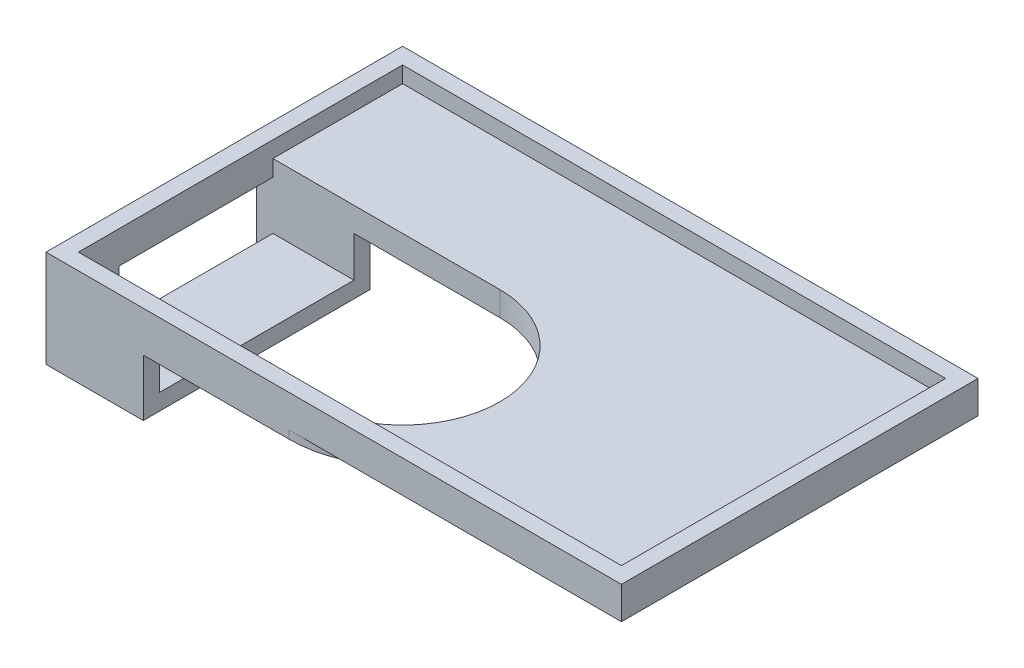
ISO-10303-21;
HEADER;
FILE_DESCRIPTION(('STEP AP214'),'2;1');
FILE_NAME('part.step','',(''),(''),'','','');
FILE_SCHEMA(('AUTOMOTIVE_DESIGN { 1 0 10303 214 1 1 1 1 }'));
ENDSEC;
DATA;
#1=APPLICATION_CONTEXT('core data for automotive mechanical design processes');
#2=APPLICATION_PROTOCOL_DEFINITION('international standard','automotive_design',2000,#1);
#3=PRODUCT_CONTEXT('',#1,'mechanical');
#4=PRODUCT('Part','Part','',(#3));
#5=PRODUCT_RELATED_PRODUCT_CATEGORY('part','',(#4));
#6=PRODUCT_DEFINITION_FORMATION('','',#4);
#7=PRODUCT_DEFINITION_CONTEXT('part definition',#1,'design');
#8=PRODUCT_DEFINITION('design','',#6,#7);
#9=PRODUCT_DEFINITION_SHAPE('','',#8);
#10=(LENGTH_UNIT() NAMED_UNIT(*) SI_UNIT(.MILLI.,.METRE.));
#11=(NAMED_UNIT(*) PLANE_ANGLE_UNIT() SI_UNIT($,.RADIAN.));
#12=(NAMED_UNIT(*) SI_UNIT($,.STERADIAN.) SOLID_ANGLE_UNIT());
#13=UNCERTAINTY_MEASURE_WITH_UNIT(LENGTH_MEASURE(1.E-05),#10,'distance_accuracy_value','');
#14=(GEOMETRIC_REPRESENTATION_CONTEXT(3) GLOBAL_UNCERTAINTY_ASSIGNED_CONTEXT((#13)) GLOBAL_UNIT_ASSIGNED_CONTEXT((#10,
#11,#12)) REPRESENTATION_CONTEXT('',''));
#15=CARTESIAN_POINT('',(0.,0.,0.));
#16=DIRECTION('',(0.,0.,1.));
#17=DIRECTION('',(1.,0.,0.));
#18=AXIS2_PLACEMENT_3D('',#15,#16,#17);
#19=CARTESIAN_POINT('',(0.,0.,0.));
#20=DIRECTION('',(0.,-1.,0.));
#21=DIRECTION('',(0.,0.,-1.));
#22=AXIS2_PLACEMENT_3D('',#19,#20,#21);
#23=PLANE('',#22);
#24=CARTESIAN_POINT('',(28.,0.,28.));
#25=DIRECTION('',(0.,-1.,0.));
#26=DIRECTION('',(0.,0.,-1.));
#27=AXIS2_PLACEMENT_3D('',#24,#25,#26);
#28=CIRCLE('',#27,14.);
#29=CARTESIAN_POINT('',(28.,0.,14.));
#30=VERTEX_POINT('',#29);
#31=CARTESIAN_POINT('',(28.,0.,42.));
#32=VERTEX_POINT('',#31);
#33=EDGE_CURVE('E228',#30,#32,#28,.T.);
#34=ORIENTED_EDGE('',*,*,#33,.F.);
#35=DIRECTION('',(1.,0.,0.));
#36=VECTOR('',#35,1.);
#37=CARTESIAN_POINT('',(10.,0.,14.));
#38=LINE('',#37,#36);
#39=CARTESIAN_POINT('',(-2.,0.,14.));
#40=VERTEX_POINT('',#39);
#41=EDGE_CURVE('E54',#40,#30,#38,.T.);
#42=ORIENTED_EDGE('',*,*,#41,.F.);
#43=DIRECTION('',(0.,0.,1.));
#44=VECTOR('',#43,1.);
#45=CARTESIAN_POINT('',(-2.,0.,0.));
#46=LINE('',#45,#44);
#47=CARTESIAN_POINT('',(-2.,0.,-2.));
#48=VERTEX_POINT('',#47);
#49=EDGE_CURVE('E334',#48,#40,#46,.T.);
#50=ORIENTED_EDGE('',*,*,#49,.F.);
#51=DIRECTION('',(1.,0.,0.));
#52=VECTOR('',#51,1.);
#53=CARTESIAN_POINT('',(0.,0.,-2.));
#54=LINE('',#53,#52);
#55=CARTESIAN_POINT('',(69.,0.,-2.));
#56=VERTEX_POINT('',#55);
#57=EDGE_CURVE('E298',#48,#56,#54,.T.);
#58=ORIENTED_EDGE('',*,*,#57,.T.);
#59=DIRECTION('',(0.,0.,1.));
#60=VECTOR('',#59,1.);
#61=CARTESIAN_POINT('',(69.,0.,0.));
#62=LINE('',#61,#60);
#63=CARTESIAN_POINT('',(69.,0.,42.));
#64=VERTEX_POINT('',#63);
#65=EDGE_CURVE('E311',#56,#64,#62,.T.);
#66=ORIENTED_EDGE('',*,*,#65,.T.);
#67=DIRECTION('',(1.,0.,0.));
#68=VECTOR('',#67,1.);
#69=CARTESIAN_POINT('',(0.,0.,42.));
#70=LINE('',#69,#68);
#71=EDGE_CURVE('E61',#32,#64,#70,.T.);
#72=ORIENTED_EDGE('',*,*,#71,.F.);
#73=EDGE_LOOP('',(#34,#42,#50,#58,#66,#72));
#74=FACE_BOUND('',#73,.T.);
#75=ADVANCED_FACE('F39',(#74),#23,.T.);
#76=CARTESIAN_POINT('',(0.,4.,40.));
#77=DIRECTION('',(0.,0.,-1.));
#78=DIRECTION('',(-1.,0.,0.));
#79=AXIS2_PLACEMENT_3D('',#76,#77,#78);
#80=PLANE('',#79);
#81=DIRECTION('',(0.,-1.,0.));
#82=VECTOR('',#81,1.);
#83=CARTESIAN_POINT('',(28.,48.6476151587624,40.));
#84=LINE('',#83,#82);
#85=CARTESIAN_POINT('',(28.,2.,40.));
#86=VERTEX_POINT('',#85);
#87=CARTESIAN_POINT('',(28.,-1.,40.));
#88=VERTEX_POINT('',#87);
#89=EDGE_CURVE('E295',#86,#88,#84,.T.);
#90=ORIENTED_EDGE('',*,*,#89,.T.);
#91=DIRECTION('',(1.,0.,0.));
#92=VECTOR('',#91,1.);
#93=CARTESIAN_POINT('',(10.,-1.,40.));
#94=LINE('',#93,#92);
#95=CARTESIAN_POINT('',(10.,-1.,40.));
#96=VERTEX_POINT('',#95);
#97=EDGE_CURVE('E220',#96,#88,#94,.T.);
#98=ORIENTED_EDGE('',*,*,#97,.F.);
#99=DIRECTION('',(0.,1.,0.));
#100=VECTOR('',#99,1.);
#101=CARTESIAN_POINT('',(10.,-8.,40.));
#102=LINE('',#101,#100);
#103=CARTESIAN_POINT('',(10.,-6.,40.));
#104=VERTEX_POINT('',#103);
#105=EDGE_CURVE('E283',#104,#96,#102,.T.);
#106=ORIENTED_EDGE('',*,*,#105,.F.);
#107=DIRECTION('',(1.,0.,0.));
#108=VECTOR('',#107,1.);
#109=CARTESIAN_POINT('',(10.,-6.,40.));
#110=LINE('',#109,#108);
#111=CARTESIAN_POINT('',(0.,-6.,40.));
#112=VERTEX_POINT('',#111);
#113=EDGE_CURVE('E206',#112,#104,#110,.T.);
#114=ORIENTED_EDGE('',*,*,#113,.F.);
#115=DIRECTION('',(0.,-1.,0.));
#116=VECTOR('',#115,1.);
#117=CARTESIAN_POINT('',(0.,4.,40.));
#118=LINE('',#117,#116);
#119=CARTESIAN_POINT('',(0.,4.,40.));
#120=VERTEX_POINT('',#119);
#121=EDGE_CURVE('E352',#120,#112,#118,.T.);
#122=ORIENTED_EDGE('',*,*,#121,.F.);
#123=DIRECTION('',(1.,0.,0.));
#124=VECTOR('',#123,1.);
#125=CARTESIAN_POINT('',(0.,4.,40.));
#126=LINE('',#125,#124);
#127=CARTESIAN_POINT('',(67.,4.,40.));
#128=VERTEX_POINT('',#127);
#129=EDGE_CURVE('E313',#120,#128,#126,.T.);
#130=ORIENTED_EDGE('',*,*,#129,.T.);
#131=DIRECTION('',(0.,-1.,0.));
#132=VECTOR('',#131,1.);
#133=CARTESIAN_POINT('',(67.,4.,40.));
#134=LINE('',#133,#132);
#135=CARTESIAN_POINT('',(67.,2.,40.));
#136=VERTEX_POINT('',#135);
#137=EDGE_CURVE('E355',#128,#136,#134,.T.);
#138=ORIENTED_EDGE('',*,*,#137,.T.);
#139=DIRECTION('',(1.,0.,0.));
#140=VECTOR('',#139,1.);
#141=CARTESIAN_POINT('',(0.,2.,40.));
#142=LINE('',#141,#140);
#143=EDGE_CURVE('E349',#86,#136,#142,.T.);
#144=ORIENTED_EDGE('',*,*,#143,.F.);
#145=EDGE_LOOP('',(#90,#98,#106,#114,#122,#130,#138,#144));
#146=FACE_BOUND('',#145,.T.);
#147=ADVANCED_FACE('F378',(#146),#80,.T.);
#148=CARTESIAN_POINT('',(0.,4.,0.));
#149=DIRECTION('',(1.,0.,0.));
#150=DIRECTION('',(0.,0.,-1.));
#151=AXIS2_PLACEMENT_3D('',#148,#149,#150);
#152=PLANE('',#151);
#153=ORIENTED_EDGE('',*,*,#121,.T.);
#154=DIRECTION('',(0.,0.,1.));
#155=VECTOR('',#154,1.);
#156=CARTESIAN_POINT('',(0.,-6.,16.));
#157=LINE('',#156,#155);
#158=CARTESIAN_POINT('',(0.,-6.,35.));
#159=VERTEX_POINT('',#158);
#160=EDGE_CURVE('E241',#159,#112,#157,.T.);
#161=ORIENTED_EDGE('',*,*,#160,.F.);
#162=DIRECTION('',(0.,1.,0.));
#163=VECTOR('',#162,1.);
#164=CARTESIAN_POINT('',(0.,-8.,35.));
#165=LINE('',#164,#163);
#166=CARTESIAN_POINT('',(0.,0.,35.));
#167=VERTEX_POINT('',#166);
#168=EDGE_CURVE('E285',#159,#167,#165,.T.);
#169=ORIENTED_EDGE('',*,*,#168,.T.);
#170=DIRECTION('',(0.,0.,1.));
#171=VECTOR('',#170,1.);
#172=CARTESIAN_POINT('',(0.,0.,0.));
#173=LINE('',#172,#171);
#174=CARTESIAN_POINT('',(0.,0.,16.));
#175=VERTEX_POINT('',#174);
#176=EDGE_CURVE('E291',#175,#167,#173,.T.);
#177=ORIENTED_EDGE('',*,*,#176,.F.);
#178=DIRECTION('',(0.,-1.,0.));
#179=VECTOR('',#178,1.);
#180=CARTESIAN_POINT('',(0.,48.6476151587624,16.));
#181=LINE('',#180,#179);
#182=CARTESIAN_POINT('',(0.,2.00000000000002,16.));
#183=VERTEX_POINT('',#182);
#184=EDGE_CURVE('E301',#183,#175,#181,.T.);
#185=ORIENTED_EDGE('',*,*,#184,.F.);
#186=DIRECTION('',(0.,0.,1.));
#187=VECTOR('',#186,1.);
#188=CARTESIAN_POINT('',(0.,2.,0.));
#189=LINE('',#188,#187);
#190=CARTESIAN_POINT('',(0.,2.,0.));
#191=VERTEX_POINT('',#190);
#192=EDGE_CURVE('E11',#191,#183,#189,.T.);
#193=ORIENTED_EDGE('',*,*,#192,.F.);
#194=DIRECTION('',(0.,-1.,0.));
#195=VECTOR('',#194,1.);
#196=CARTESIAN_POINT('',(0.,4.,0.));
#197=LINE('',#196,#195);
#198=CARTESIAN_POINT('',(0.,4.,0.));
#199=VERTEX_POINT('',#198);
#200=EDGE_CURVE('E330',#199,#191,#197,.T.);
#201=ORIENTED_EDGE('',*,*,#200,.F.);
#202=DIRECTION('',(0.,0.,1.));
#203=VECTOR('',#202,1.);
#204=CARTESIAN_POINT('',(0.,4.,0.));
#205=LINE('',#204,#203);
#206=EDGE_CURVE('E316',#199,#120,#205,.T.);
#207=ORIENTED_EDGE('',*,*,#206,.T.);
#208=EDGE_LOOP('',(#153,#161,#169,#177,#185,#193,#201,#207));
#209=FACE_BOUND('',#208,.T.);
#210=ADVANCED_FACE('F387',(#209),#152,.T.);
#211=CARTESIAN_POINT('',(0.,48.6476151587624,16.));
#212=DIRECTION('',(0.,0.,-1.));
#213=DIRECTION('',(-1.,0.,0.));
#214=AXIS2_PLACEMENT_3D('',#211,#212,#213);
#215=PLANE('',#214);
#216=DIRECTION('',(-1.,0.,0.));
#217=VECTOR('',#216,1.);
#218=CARTESIAN_POINT('',(10.,-1.,16.));
#219=LINE('',#218,#217);
#220=CARTESIAN_POINT('',(28.,-1.,16.));
#221=VERTEX_POINT('',#220);
#222=CARTESIAN_POINT('',(10.,-1.,16.));
#223=VERTEX_POINT('',#222);
#224=EDGE_CURVE('E226',#221,#223,#219,.T.);
#225=ORIENTED_EDGE('',*,*,#224,.F.);
#226=DIRECTION('',(0.,-1.,0.));
#227=VECTOR('',#226,1.);
#228=CARTESIAN_POINT('',(28.,48.6476151587624,16.));
#229=LINE('',#228,#227);
#230=CARTESIAN_POINT('',(28.,2.,16.));
#231=VERTEX_POINT('',#230);
#232=EDGE_CURVE('E304',#231,#221,#229,.T.);
#233=ORIENTED_EDGE('',*,*,#232,.F.);
#234=DIRECTION('',(-1.,0.,0.));
#235=VECTOR('',#234,1.);
#236=CARTESIAN_POINT('',(0.,2.,16.));
#237=LINE('',#236,#235);
#238=EDGE_CURVE('E292',#231,#183,#237,.T.);
#239=ORIENTED_EDGE('',*,*,#238,.T.);
#240=ORIENTED_EDGE('',*,*,#184,.T.);
#241=DIRECTION('',(-1.,0.,0.));
#242=VECTOR('',#241,1.);
#243=CARTESIAN_POINT('',(10.,0.,16.));
#244=LINE('',#243,#242);
#245=CARTESIAN_POINT('',(-2.,0.,16.));
#246=VERTEX_POINT('',#245);
#247=EDGE_CURVE('E259',#175,#246,#244,.T.);
#248=ORIENTED_EDGE('',*,*,#247,.T.);
#249=DIRECTION('',(0.,1.,0.));
#250=VECTOR('',#249,1.);
#251=CARTESIAN_POINT('',(-2.,-8.,16.));
#252=LINE('',#251,#250);
#253=CARTESIAN_POINT('',(-2.,-8.,16.));
#254=VERTEX_POINT('',#253);
#255=EDGE_CURVE('E250',#254,#246,#252,.T.);
#256=ORIENTED_EDGE('',*,*,#255,.F.);
#257=DIRECTION('',(-1.,0.,0.));
#258=VECTOR('',#257,1.);
#259=CARTESIAN_POINT('',(10.,-8.,16.));
#260=LINE('',#259,#258);
#261=CARTESIAN_POINT('',(0.,-8.,16.));
#262=VERTEX_POINT('',#261);
#263=EDGE_CURVE('E260',#262,#254,#260,.T.);
#264=ORIENTED_EDGE('',*,*,#263,.F.);
#265=DIRECTION('',(0.,1.,0.));
#266=VECTOR('',#265,1.);
#267=CARTESIAN_POINT('',(0.,-8.,16.));
#268=LINE('',#267,#266);
#269=CARTESIAN_POINT('',(0.,-6.,16.));
#270=VERTEX_POINT('',#269);
#271=EDGE_CURVE('E231',#262,#270,#268,.T.);
#272=ORIENTED_EDGE('',*,*,#271,.T.);
#273=DIRECTION('',(1.,0.,0.));
#274=VECTOR('',#273,1.);
#275=CARTESIAN_POINT('',(10.,-6.,16.));
#276=LINE('',#275,#274);
#277=CARTESIAN_POINT('',(10.,-6.,16.));
#278=VERTEX_POINT('',#277);
#279=EDGE_CURVE('E234',#270,#278,#276,.T.);
#280=ORIENTED_EDGE('',*,*,#279,.T.);
#281=DIRECTION('',(0.,1.,0.));
#282=VECTOR('',#281,1.);
#283=CARTESIAN_POINT('',(10.,-8.,16.));
#284=LINE('',#283,#282);
#285=EDGE_CURVE('E247',#278,#223,#284,.T.);
#286=ORIENTED_EDGE('',*,*,#285,.T.);
#287=EDGE_LOOP('',(#225,#233,#239,#240,#248,#256,#264,#272,#280,#286));
#288=FACE_BOUND('',#287,.T.);
#289=ADVANCED_FACE('F393',(#288),#215,.F.);
#290=CARTESIAN_POINT('',(-2.,0.,35.));
#291=VERTEX_POINT('',#290);
#292=EDGE_CURVE('E333',#246,#291,#46,.T.);
#293=ORIENTED_EDGE('',*,*,#292,.F.);
#294=ORIENTED_EDGE('',*,*,#247,.F.);
#295=ORIENTED_EDGE('',*,*,#176,.T.);
#296=DIRECTION('',(1.,0.,0.));
#297=VECTOR('',#296,1.);
#298=CARTESIAN_POINT('',(-1.99999999999999,0.,35.));
#299=LINE('',#298,#297);
#300=EDGE_CURVE('E262',#291,#167,#299,.T.);
#301=ORIENTED_EDGE('',*,*,#300,.F.);
#302=EDGE_LOOP('',(#293,#294,#295,#301));
#303=FACE_BOUND('',#302,.T.);
#304=ADVANCED_FACE('F41',(#303),#23,.T.);
#305=CARTESIAN_POINT('',(0.,2.,0.));
#306=DIRECTION('',(0.,-1.,0.));
#307=DIRECTION('',(0.,0.,-1.));
#308=AXIS2_PLACEMENT_3D('',#305,#306,#307);
#309=PLANE('',#308);
#310=CARTESIAN_POINT('',(28.,2.,28.));
#311=DIRECTION('',(0.,-1.,0.));
#312=DIRECTION('',(0.,0.,-1.));
#313=AXIS2_PLACEMENT_3D('',#310,#311,#312);
#314=CIRCLE('',#313,12.);
#315=EDGE_CURVE('E294',#86,#231,#314,.F.);
#316=ORIENTED_EDGE('',*,*,#315,.F.);
#317=ORIENTED_EDGE('',*,*,#143,.T.);
#318=DIRECTION('',(0.,0.,1.));
#319=VECTOR('',#318,1.);
#320=CARTESIAN_POINT('',(67.,2.,0.));
#321=LINE('',#320,#319);
#322=CARTESIAN_POINT('',(67.,2.,0.));
#323=VERTEX_POINT('',#322);
#324=EDGE_CURVE('E361',#323,#136,#321,.T.);
#325=ORIENTED_EDGE('',*,*,#324,.F.);
#326=DIRECTION('',(1.,0.,0.));
#327=VECTOR('',#326,1.);
#328=CARTESIAN_POINT('',(0.,2.,0.));
#329=LINE('',#328,#327);
#330=EDGE_CURVE('E47',#191,#323,#329,.T.);
#331=ORIENTED_EDGE('',*,*,#330,.F.);
#332=ORIENTED_EDGE('',*,*,#192,.T.);
#333=ORIENTED_EDGE('',*,*,#238,.F.);
#334=EDGE_LOOP('',(#316,#317,#325,#331,#332,#333));
#335=FACE_BOUND('',#334,.T.);
#336=ADVANCED_FACE('F374',(#335),#309,.F.);
#337=CARTESIAN_POINT('',(0.,4.,0.));
#338=DIRECTION('',(0.,0.,-1.));
#339=DIRECTION('',(-1.,0.,0.));
#340=AXIS2_PLACEMENT_3D('',#337,#338,#339);
#341=PLANE('',#340);
#342=ORIENTED_EDGE('',*,*,#200,.T.);
#343=ORIENTED_EDGE('',*,*,#330,.T.);
#344=DIRECTION('',(0.,-1.,0.));
#345=VECTOR('',#344,1.);
#346=CARTESIAN_POINT('',(67.,4.,0.));
#347=LINE('',#346,#345);
#348=CARTESIAN_POINT('',(67.,4.,0.));
#349=VERTEX_POINT('',#348);
#350=EDGE_CURVE('E342',#349,#323,#347,.T.);
#351=ORIENTED_EDGE('',*,*,#350,.F.);
#352=DIRECTION('',(1.,0.,0.));
#353=VECTOR('',#352,1.);
#354=CARTESIAN_POINT('',(0.,4.,0.));
#355=LINE('',#354,#353);
#356=EDGE_CURVE('E307',#199,#349,#355,.T.);
#357=ORIENTED_EDGE('',*,*,#356,.F.);
#358=EDGE_LOOP('',(#342,#343,#351,#357));
#359=FACE_BOUND('',#358,.T.);
#360=ADVANCED_FACE('F366',(#359),#341,.F.);
#361=CARTESIAN_POINT('',(67.,4.,0.));
#362=DIRECTION('',(1.,0.,0.));
#363=DIRECTION('',(0.,0.,-1.));
#364=AXIS2_PLACEMENT_3D('',#361,#362,#363);
#365=PLANE('',#364);
#366=ORIENTED_EDGE('',*,*,#350,.T.);
#367=ORIENTED_EDGE('',*,*,#324,.T.);
#368=ORIENTED_EDGE('',*,*,#137,.F.);
#369=DIRECTION('',(0.,0.,1.));
#370=VECTOR('',#369,1.);
#371=CARTESIAN_POINT('',(67.,4.,0.));
#372=LINE('',#371,#370);
#373=EDGE_CURVE('E310',#349,#128,#372,.T.);
#374=ORIENTED_EDGE('',*,*,#373,.F.);
#375=EDGE_LOOP('',(#366,#367,#368,#374));
#376=FACE_BOUND('',#375,.T.);
#377=ADVANCED_FACE('F371',(#376),#365,.F.);
#378=CARTESIAN_POINT('',(0.,4.,-2.));
#379=DIRECTION('',(0.,0.,-1.));
#380=DIRECTION('',(-1.,0.,0.));
#381=AXIS2_PLACEMENT_3D('',#378,#379,#380);
#382=PLANE('',#381);
#383=ORIENTED_EDGE('',*,*,#57,.F.);
#384=DIRECTION('',(0.,-1.,0.));
#385=VECTOR('',#384,1.);
#386=CARTESIAN_POINT('',(-2.,4.,-2.));
#387=LINE('',#386,#385);
#388=CARTESIAN_POINT('',(-2.,4.,-2.));
#389=VERTEX_POINT('',#388);
#390=EDGE_CURVE('E347',#389,#48,#387,.T.);
#391=ORIENTED_EDGE('',*,*,#390,.F.);
#392=DIRECTION('',(1.,0.,0.));
#393=VECTOR('',#392,1.);
#394=CARTESIAN_POINT('',(0.,4.,-2.));
#395=LINE('',#394,#393);
#396=CARTESIAN_POINT('',(69.,4.,-2.));
#397=VERTEX_POINT('',#396);
#398=EDGE_CURVE('E319',#389,#397,#395,.T.);
#399=ORIENTED_EDGE('',*,*,#398,.T.);
#400=DIRECTION('',(0.,-1.,0.));
#401=VECTOR('',#400,1.);
#402=CARTESIAN_POINT('',(69.,4.,-2.));
#403=LINE('',#402,#401);
#404=EDGE_CURVE('E339',#397,#56,#403,.T.);
#405=ORIENTED_EDGE('',*,*,#404,.T.);
#406=EDGE_LOOP('',(#383,#391,#399,#405));
#407=FACE_BOUND('',#406,.T.);
#408=ADVANCED_FACE('F438',(#407),#382,.T.);
#409=CARTESIAN_POINT('',(-2.,4.,0.));
#410=DIRECTION('',(1.,0.,0.));
#411=DIRECTION('',(0.,0.,-1.));
#412=AXIS2_PLACEMENT_3D('',#409,#410,#411);
#413=PLANE('',#412);
#414=ORIENTED_EDGE('',*,*,#49,.T.);
#415=DIRECTION('',(0.,1.,0.));
#416=VECTOR('',#415,1.);
#417=CARTESIAN_POINT('',(-2.,-8.,14.));
#418=LINE('',#417,#416);
#419=CARTESIAN_POINT('',(-2.,-8.,14.));
#420=VERTEX_POINT('',#419);
#421=EDGE_CURVE('E253',#420,#40,#418,.T.);
#422=ORIENTED_EDGE('',*,*,#421,.F.);
#423=DIRECTION('',(0.,0.,-1.));
#424=VECTOR('',#423,1.);
#425=CARTESIAN_POINT('',(-2.,-8.,16.));
#426=LINE('',#425,#424);
#427=EDGE_CURVE('E265',#254,#420,#426,.T.);
#428=ORIENTED_EDGE('',*,*,#427,.F.);
#429=ORIENTED_EDGE('',*,*,#255,.T.);
#430=ORIENTED_EDGE('',*,*,#292,.T.);
#431=DIRECTION('',(0.,1.,0.));
#432=VECTOR('',#431,1.);
#433=CARTESIAN_POINT('',(-1.99999999999999,-8.,35.));
#434=LINE('',#433,#432);
#435=CARTESIAN_POINT('',(-1.99999999999999,-8.,35.));
#436=VERTEX_POINT('',#435);
#437=EDGE_CURVE('E288',#436,#291,#434,.T.);
#438=ORIENTED_EDGE('',*,*,#437,.F.);
#439=DIRECTION('',(0.,0.,-1.));
#440=VECTOR('',#439,1.);
#441=CARTESIAN_POINT('',(-2.,-8.,42.));
#442=LINE('',#441,#440);
#443=CARTESIAN_POINT('',(-2.,-8.,42.));
#444=VERTEX_POINT('',#443);
#445=EDGE_CURVE('E268',#444,#436,#442,.T.);
#446=ORIENTED_EDGE('',*,*,#445,.F.);
#447=DIRECTION('',(0.,-1.,0.));
#448=VECTOR('',#447,1.);
#449=CARTESIAN_POINT('',(-2.,4.,42.));
#450=LINE('',#449,#448);
#451=CARTESIAN_POINT('',(-2.,4.,42.));
#452=VERTEX_POINT('',#451);
#453=EDGE_CURVE('E345',#452,#444,#450,.T.);
#454=ORIENTED_EDGE('',*,*,#453,.F.);
#455=DIRECTION('',(0.,0.,1.));
#456=VECTOR('',#455,1.);
#457=CARTESIAN_POINT('',(-2.,4.,0.));
#458=LINE('',#457,#456);
#459=EDGE_CURVE('E322',#389,#452,#458,.T.);
#460=ORIENTED_EDGE('',*,*,#459,.F.);
#461=ORIENTED_EDGE('',*,*,#390,.T.);
#462=EDGE_LOOP('',(#414,#422,#428,#429,#430,#438,#446,#454,#460,#461));
#463=FACE_BOUND('',#462,.T.);
#464=ADVANCED_FACE('F423',(#463),#413,.F.);
#465=CARTESIAN_POINT('',(0.,4.,42.));
#466=DIRECTION('',(0.,0.,-1.));
#467=DIRECTION('',(-1.,0.,0.));
#468=AXIS2_PLACEMENT_3D('',#465,#466,#467);
#469=PLANE('',#468);
#470=DIRECTION('',(0.,1.,0.));
#471=VECTOR('',#470,1.);
#472=CARTESIAN_POINT('',(28.,-1.,42.));
#473=LINE('',#472,#471);
#474=CARTESIAN_POINT('',(28.,-1.,42.));
#475=VERTEX_POINT('',#474);
#476=EDGE_CURVE('E207',#475,#32,#473,.T.);
#477=ORIENTED_EDGE('',*,*,#476,.T.);
#478=ORIENTED_EDGE('',*,*,#71,.T.);
#479=DIRECTION('',(0.,-1.,0.));
#480=VECTOR('',#479,1.);
#481=CARTESIAN_POINT('',(69.,4.,42.));
#482=LINE('',#481,#480);
#483=CARTESIAN_POINT('',(69.,4.,42.));
#484=VERTEX_POINT('',#483);
#485=EDGE_CURVE('E341',#484,#64,#482,.T.);
#486=ORIENTED_EDGE('',*,*,#485,.F.);
#487=DIRECTION('',(1.,0.,0.));
#488=VECTOR('',#487,1.);
#489=CARTESIAN_POINT('',(0.,4.,42.));
#490=LINE('',#489,#488);
#491=EDGE_CURVE('E325',#452,#484,#490,.T.);
#492=ORIENTED_EDGE('',*,*,#491,.F.);
#493=ORIENTED_EDGE('',*,*,#453,.T.);
#494=DIRECTION('',(-1.,0.,0.));
#495=VECTOR('',#494,1.);
#496=CARTESIAN_POINT('',(-2.,-8.,42.));
#497=LINE('',#496,#495);
#498=CARTESIAN_POINT('',(10.,-8.,42.));
#499=VERTEX_POINT('',#498);
#500=EDGE_CURVE('E275',#499,#444,#497,.T.);
#501=ORIENTED_EDGE('',*,*,#500,.F.);
#502=DIRECTION('',(0.,1.,0.));
#503=VECTOR('',#502,1.);
#504=CARTESIAN_POINT('',(10.,-8.,42.));
#505=LINE('',#504,#503);
#506=CARTESIAN_POINT('',(10.,-1.,42.));
#507=VERTEX_POINT('',#506);
#508=EDGE_CURVE('E278',#499,#507,#505,.T.);
#509=ORIENTED_EDGE('',*,*,#508,.T.);
#510=DIRECTION('',(-1.,0.,0.));
#511=VECTOR('',#510,1.);
#512=CARTESIAN_POINT('',(10.,-1.,42.));
#513=LINE('',#512,#511);
#514=EDGE_CURVE('E212',#475,#507,#513,.T.);
#515=ORIENTED_EDGE('',*,*,#514,.F.);
#516=EDGE_LOOP('',(#477,#478,#486,#492,#493,#501,#509,#515));
#517=FACE_BOUND('',#516,.T.);
#518=ADVANCED_FACE('F430',(#517),#469,.F.);
#519=CARTESIAN_POINT('',(69.,4.,0.));
#520=DIRECTION('',(1.,0.,0.));
#521=DIRECTION('',(0.,0.,-1.));
#522=AXIS2_PLACEMENT_3D('',#519,#520,#521);
#523=PLANE('',#522);
#524=ORIENTED_EDGE('',*,*,#65,.F.);
#525=ORIENTED_EDGE('',*,*,#404,.F.);
#526=DIRECTION('',(0.,0.,1.));
#527=VECTOR('',#526,1.);
#528=CARTESIAN_POINT('',(69.,4.,0.));
#529=LINE('',#528,#527);
#530=EDGE_CURVE('E327',#397,#484,#529,.T.);
#531=ORIENTED_EDGE('',*,*,#530,.T.);
#532=ORIENTED_EDGE('',*,*,#485,.T.);
#533=EDGE_LOOP('',(#524,#525,#531,#532));
#534=FACE_BOUND('',#533,.T.);
#535=ADVANCED_FACE('F441',(#534),#523,.T.);
#536=CARTESIAN_POINT('',(0.,4.,0.));
#537=DIRECTION('',(0.,1.,0.));
#538=DIRECTION('',(0.,0.,1.));
#539=AXIS2_PLACEMENT_3D('',#536,#537,#538);
#540=PLANE('',#539);
#541=ORIENTED_EDGE('',*,*,#356,.T.);
#542=ORIENTED_EDGE('',*,*,#373,.T.);
#543=ORIENTED_EDGE('',*,*,#129,.F.);
#544=ORIENTED_EDGE('',*,*,#206,.F.);
#545=EDGE_LOOP('',(#541,#542,#543,#544));
#546=FACE_BOUND('',#545,.T.);
#547=ORIENTED_EDGE('',*,*,#398,.F.);
#548=ORIENTED_EDGE('',*,*,#459,.T.);
#549=ORIENTED_EDGE('',*,*,#491,.T.);
#550=ORIENTED_EDGE('',*,*,#530,.F.);
#551=EDGE_LOOP('',(#547,#548,#549,#550));
#552=FACE_BOUND('',#551,.T.);
#553=ADVANCED_FACE('F384',(#546,#552),#540,.T.);
#554=CARTESIAN_POINT('',(28.,48.6476151587624,28.));
#555=DIRECTION('',(0.,-1.,0.));
#556=DIRECTION('',(0.,0.,-1.));
#557=AXIS2_PLACEMENT_3D('',#554,#555,#556);
#558=CYLINDRICAL_SURFACE('',#557,12.);
#559=ORIENTED_EDGE('',*,*,#315,.T.);
#560=ORIENTED_EDGE('',*,*,#232,.T.);
#561=CARTESIAN_POINT('',(28.,-1.,28.));
#562=DIRECTION('',(0.,1.,0.));
#563=DIRECTION('',(0.,0.,-1.));
#564=AXIS2_PLACEMENT_3D('',#561,#562,#563);
#565=CIRCLE('',#564,12.);
#566=EDGE_CURVE('E223',#88,#221,#565,.T.);
#567=ORIENTED_EDGE('',*,*,#566,.F.);
#568=ORIENTED_EDGE('',*,*,#89,.F.);
#569=EDGE_LOOP('',(#559,#560,#567,#568));
#570=FACE_BOUND('',#569,.T.);
#571=ADVANCED_FACE('F396',(#570),#558,.F.);
#572=CARTESIAN_POINT('',(-1.99999999999999,-8.,35.));
#573=DIRECTION('',(0.,0.,1.));
#574=DIRECTION('',(1.,0.,0.));
#575=AXIS2_PLACEMENT_3D('',#572,#573,#574);
#576=PLANE('',#575);
#577=ORIENTED_EDGE('',*,*,#300,.T.);
#578=ORIENTED_EDGE('',*,*,#168,.F.);
#579=CARTESIAN_POINT('',(0.,-8.,35.));
#580=VERTEX_POINT('',#579);
#581=EDGE_CURVE('E286',#580,#159,#165,.T.);
#582=ORIENTED_EDGE('',*,*,#581,.F.);
#583=DIRECTION('',(1.,0.,0.));
#584=VECTOR('',#583,1.);
#585=CARTESIAN_POINT('',(-1.99999999999999,-8.,35.));
#586=LINE('',#585,#584);
#587=EDGE_CURVE('E270',#436,#580,#586,.T.);
#588=ORIENTED_EDGE('',*,*,#587,.F.);
#589=ORIENTED_EDGE('',*,*,#437,.T.);
#590=EDGE_LOOP('',(#577,#578,#582,#588,#589));
#591=FACE_BOUND('',#590,.T.);
#592=ADVANCED_FACE('F418',(#591),#576,.F.);
#593=CARTESIAN_POINT('',(10.,-8.,42.));
#594=DIRECTION('',(-1.,0.,0.));
#595=DIRECTION('',(0.,0.,1.));
#596=AXIS2_PLACEMENT_3D('',#593,#594,#595);
#597=PLANE('',#596);
#598=DIRECTION('',(0.,1.,0.));
#599=VECTOR('',#598,1.);
#600=CARTESIAN_POINT('',(10.,-8.,14.));
#601=LINE('',#600,#599);
#602=CARTESIAN_POINT('',(10.,-8.,14.));
#603=VERTEX_POINT('',#602);
#604=CARTESIAN_POINT('',(10.,-1.,14.));
#605=VERTEX_POINT('',#604);
#606=EDGE_CURVE('E255',#603,#605,#601,.T.);
#607=ORIENTED_EDGE('',*,*,#606,.T.);
#608=DIRECTION('',(0.,0.,-1.));
#609=VECTOR('',#608,1.);
#610=CARTESIAN_POINT('',(10.,-1.,14.));
#611=LINE('',#610,#609);
#612=EDGE_CURVE('E199',#223,#605,#611,.T.);
#613=ORIENTED_EDGE('',*,*,#612,.F.);
#614=ORIENTED_EDGE('',*,*,#285,.F.);
#615=DIRECTION('',(0.,0.,1.));
#616=VECTOR('',#615,1.);
#617=CARTESIAN_POINT('',(10.,-6.,16.));
#618=LINE('',#617,#616);
#619=EDGE_CURVE('E237',#278,#104,#618,.T.);
#620=ORIENTED_EDGE('',*,*,#619,.T.);
#621=ORIENTED_EDGE('',*,*,#105,.T.);
#622=DIRECTION('',(0.,0.,-1.));
#623=VECTOR('',#622,1.);
#624=CARTESIAN_POINT('',(10.,-1.,40.));
#625=LINE('',#624,#623);
#626=EDGE_CURVE('E214',#507,#96,#625,.T.);
#627=ORIENTED_EDGE('',*,*,#626,.F.);
#628=ORIENTED_EDGE('',*,*,#508,.F.);
#629=DIRECTION('',(0.,0.,1.));
#630=VECTOR('',#629,1.);
#631=CARTESIAN_POINT('',(10.,-8.,42.));
#632=LINE('',#631,#630);
#633=EDGE_CURVE('E273',#603,#499,#632,.T.);
#634=ORIENTED_EDGE('',*,*,#633,.F.);
#635=EDGE_LOOP('',(#607,#613,#614,#620,#621,#627,#628,#634));
#636=FACE_BOUND('',#635,.T.);
#637=ADVANCED_FACE('F399',(#636),#597,.F.);
#638=CARTESIAN_POINT('',(0.,-8.,0.));
#639=DIRECTION('',(0.,-1.,0.));
#640=DIRECTION('',(0.,0.,-1.));
#641=AXIS2_PLACEMENT_3D('',#638,#639,#640);
#642=PLANE('',#641);
#643=ORIENTED_EDGE('',*,*,#445,.T.);
#644=ORIENTED_EDGE('',*,*,#587,.T.);
#645=DIRECTION('',(0.,0.,1.));
#646=VECTOR('',#645,1.);
#647=CARTESIAN_POINT('',(0.,-8.,16.));
#648=LINE('',#647,#646);
#649=EDGE_CURVE('E245',#262,#580,#648,.T.);
#650=ORIENTED_EDGE('',*,*,#649,.F.);
#651=ORIENTED_EDGE('',*,*,#263,.T.);
#652=ORIENTED_EDGE('',*,*,#427,.T.);
#653=DIRECTION('',(1.,0.,0.));
#654=VECTOR('',#653,1.);
#655=CARTESIAN_POINT('',(10.,-8.,14.));
#656=LINE('',#655,#654);
#657=EDGE_CURVE('E257',#420,#603,#656,.T.);
#658=ORIENTED_EDGE('',*,*,#657,.T.);
#659=ORIENTED_EDGE('',*,*,#633,.T.);
#660=ORIENTED_EDGE('',*,*,#500,.T.);
#661=EDGE_LOOP('',(#643,#644,#650,#651,#652,#658,#659,#660));
#662=FACE_BOUND('',#661,.T.);
#663=ADVANCED_FACE('F411',(#662),#642,.T.);
#664=CARTESIAN_POINT('',(10.,-8.,14.));
#665=DIRECTION('',(0.,0.,1.));
#666=DIRECTION('',(1.,0.,0.));
#667=AXIS2_PLACEMENT_3D('',#664,#665,#666);
#668=PLANE('',#667);
#669=ORIENTED_EDGE('',*,*,#41,.T.);
#670=DIRECTION('',(0.,1.,0.));
#671=VECTOR('',#670,1.);
#672=CARTESIAN_POINT('',(28.,-1.,14.));
#673=LINE('',#672,#671);
#674=CARTESIAN_POINT('',(28.,-1.,14.));
#675=VERTEX_POINT('',#674);
#676=EDGE_CURVE('E203',#675,#30,#673,.T.);
#677=ORIENTED_EDGE('',*,*,#676,.F.);
#678=DIRECTION('',(1.,0.,0.));
#679=VECTOR('',#678,1.);
#680=CARTESIAN_POINT('',(10.,-1.,14.));
#681=LINE('',#680,#679);
#682=EDGE_CURVE('E192',#605,#675,#681,.T.);
#683=ORIENTED_EDGE('',*,*,#682,.F.);
#684=ORIENTED_EDGE('',*,*,#606,.F.);
#685=ORIENTED_EDGE('',*,*,#657,.F.);
#686=ORIENTED_EDGE('',*,*,#421,.T.);
#687=EDGE_LOOP('',(#669,#677,#683,#684,#685,#686));
#688=FACE_BOUND('',#687,.T.);
#689=ADVANCED_FACE('F204',(#688),#668,.F.);
#690=CARTESIAN_POINT('',(0.,-8.,16.));
#691=DIRECTION('',(1.,0.,0.));
#692=DIRECTION('',(0.,1.,0.));
#693=AXIS2_PLACEMENT_3D('',#690,#691,#692);
#694=PLANE('',#693);
#695=ORIENTED_EDGE('',*,*,#649,.T.);
#696=ORIENTED_EDGE('',*,*,#581,.T.);
#697=EDGE_CURVE('E242',#270,#159,#157,.T.);
#698=ORIENTED_EDGE('',*,*,#697,.F.);
#699=ORIENTED_EDGE('',*,*,#271,.F.);
#700=EDGE_LOOP('',(#695,#696,#698,#699));
#701=FACE_BOUND('',#700,.T.);
#702=ADVANCED_FACE('F409',(#701),#694,.F.);
#703=CARTESIAN_POINT('',(10.,-6.,16.));
#704=DIRECTION('',(0.,-1.,0.));
#705=DIRECTION('',(0.,0.,-1.));
#706=AXIS2_PLACEMENT_3D('',#703,#704,#705);
#707=PLANE('',#706);
#708=ORIENTED_EDGE('',*,*,#113,.T.);
#709=ORIENTED_EDGE('',*,*,#619,.F.);
#710=ORIENTED_EDGE('',*,*,#279,.F.);
#711=ORIENTED_EDGE('',*,*,#697,.T.);
#712=ORIENTED_EDGE('',*,*,#160,.T.);
#713=EDGE_LOOP('',(#708,#709,#710,#711,#712));
#714=FACE_BOUND('',#713,.T.);
#715=ADVANCED_FACE('F404',(#714),#707,.F.);
#716=CARTESIAN_POINT('',(28.,-1.,28.));
#717=DIRECTION('',(0.,1.,0.));
#718=DIRECTION('',(0.,0.,1.));
#719=AXIS2_PLACEMENT_3D('',#716,#717,#718);
#720=CYLINDRICAL_SURFACE('',#719,14.);
#721=ORIENTED_EDGE('',*,*,#33,.T.);
#722=ORIENTED_EDGE('',*,*,#476,.F.);
#723=CARTESIAN_POINT('',(28.,-1.,28.));
#724=DIRECTION('',(0.,-1.,0.));
#725=DIRECTION('',(0.,0.,-1.));
#726=AXIS2_PLACEMENT_3D('',#723,#724,#725);
#727=CIRCLE('',#726,14.);
#728=EDGE_CURVE('E196',#675,#475,#727,.T.);
#729=ORIENTED_EDGE('',*,*,#728,.F.);
#730=ORIENTED_EDGE('',*,*,#676,.T.);
#731=EDGE_LOOP('',(#721,#722,#729,#730));
#732=FACE_BOUND('',#731,.T.);
#733=ADVANCED_FACE('F209',(#732),#720,.T.);
#734=CARTESIAN_POINT('',(28.,-1.,28.));
#735=DIRECTION('',(0.,-1.,0.));
#736=DIRECTION('',(0.,0.,-1.));
#737=AXIS2_PLACEMENT_3D('',#734,#735,#736);
#738=PLANE('',#737);
#739=ORIENTED_EDGE('',*,*,#612,.T.);
#740=ORIENTED_EDGE('',*,*,#682,.T.);
#741=ORIENTED_EDGE('',*,*,#728,.T.);
#742=ORIENTED_EDGE('',*,*,#514,.T.);
#743=ORIENTED_EDGE('',*,*,#626,.T.);
#744=ORIENTED_EDGE('',*,*,#97,.T.);
#745=ORIENTED_EDGE('',*,*,#566,.T.);
#746=ORIENTED_EDGE('',*,*,#224,.T.);
#747=EDGE_LOOP('',(#739,#740,#741,#742,#743,#744,#745,#746));
#748=FACE_BOUND('',#747,.T.);
#749=ADVANCED_FACE('F193',(#748),#738,.T.);
#750=CLOSED_SHELL('',(#75,#147,#210,#289,#304,#336,#360,#377,#408,#464,#518,#535,#553,#571,#592,
#637,#663,#689,#702,#715,#733,#749));
#751=MANIFOLD_SOLID_BREP('B2',#750);
#752=ADVANCED_BREP_SHAPE_REPRESENTATION('',(#18,#751),#14);
#753=SHAPE_DEFINITION_REPRESENTATION(#9,#752);
ENDSEC;
END-ISO-10303-21;
